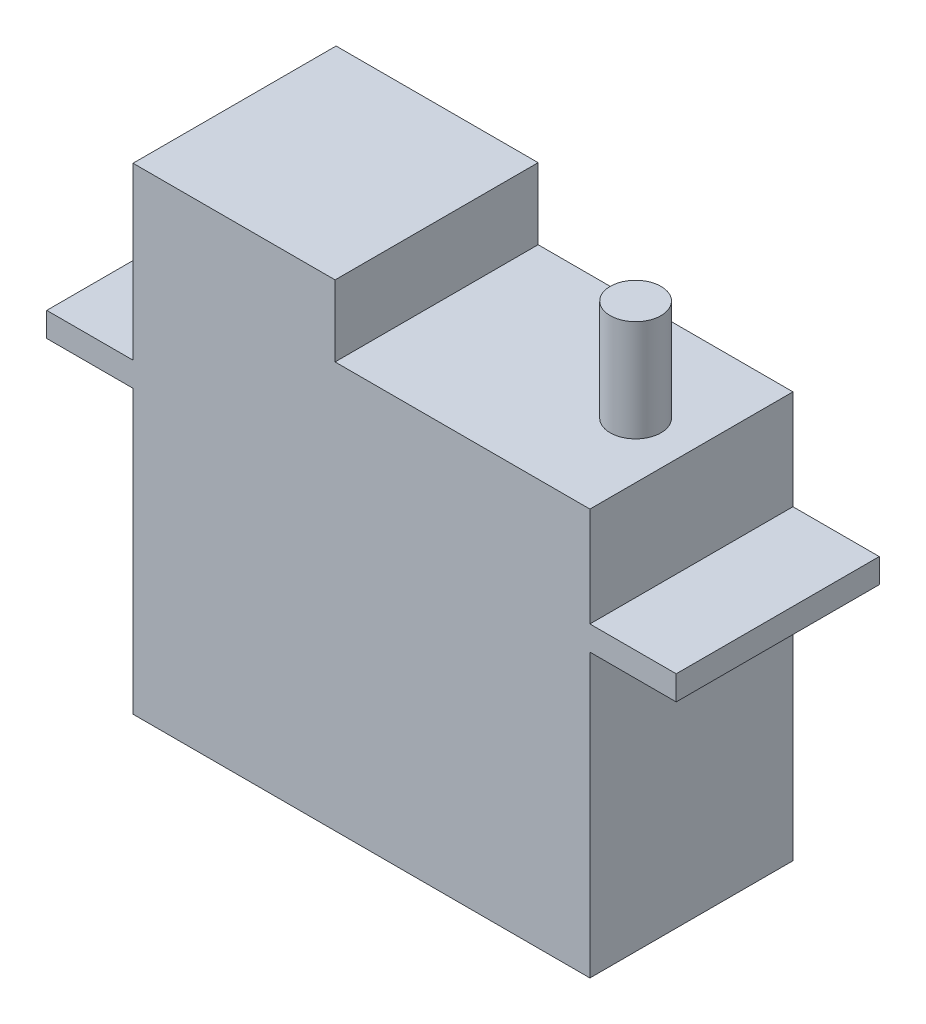
ISO-10303-21;
HEADER;
FILE_DESCRIPTION(('STEP AP214'),'2;1');
FILE_NAME('part.step','',(''),(''),'','','');
FILE_SCHEMA(('AUTOMOTIVE_DESIGN { 1 0 10303 214 1 1 1 1 }'));
ENDSEC;
DATA;
#1=APPLICATION_CONTEXT('core data for automotive mechanical design processes');
#2=APPLICATION_PROTOCOL_DEFINITION('international standard','automotive_design',2000,#1);
#3=PRODUCT_CONTEXT('',#1,'mechanical');
#4=PRODUCT('Part','Part','',(#3));
#5=PRODUCT_RELATED_PRODUCT_CATEGORY('part','',(#4));
#6=PRODUCT_DEFINITION_FORMATION('','',#4);
#7=PRODUCT_DEFINITION_CONTEXT('part definition',#1,'design');
#8=PRODUCT_DEFINITION('design','',#6,#7);
#9=PRODUCT_DEFINITION_SHAPE('','',#8);
#10=(LENGTH_UNIT() NAMED_UNIT(*) SI_UNIT(.MILLI.,.METRE.));
#11=(NAMED_UNIT(*) PLANE_ANGLE_UNIT() SI_UNIT($,.RADIAN.));
#12=(NAMED_UNIT(*) SI_UNIT($,.STERADIAN.) SOLID_ANGLE_UNIT());
#13=UNCERTAINTY_MEASURE_WITH_UNIT(LENGTH_MEASURE(1.E-05),#10,'distance_accuracy_value','');
#14=(GEOMETRIC_REPRESENTATION_CONTEXT(3) GLOBAL_UNCERTAINTY_ASSIGNED_CONTEXT((#13)) GLOBAL_UNIT_ASSIGNED_CONTEXT((#10,
#11,#12)) REPRESENTATION_CONTEXT('',''));
#15=CARTESIAN_POINT('',(0.,0.,0.));
#16=DIRECTION('',(0.,0.,1.));
#17=DIRECTION('',(1.,0.,0.));
#18=AXIS2_PLACEMENT_3D('',#15,#16,#17);
#19=CARTESIAN_POINT('',(22.5,20.,-5.));
#20=DIRECTION('',(-1.,0.,0.));
#21=DIRECTION('',(0.,-1.,0.));
#22=AXIS2_PLACEMENT_3D('',#19,#20,#21);
#23=PLANE('',#22);
#24=DIRECTION('',(0.,0.,1.));
#25=VECTOR('',#24,1.);
#26=CARTESIAN_POINT('',(22.5,20.,-5.));
#27=LINE('',#26,#25);
#28=CARTESIAN_POINT('',(22.5,20.,-5.));
#29=VERTEX_POINT('',#28);
#30=CARTESIAN_POINT('',(22.5,20.,5.));
#31=VERTEX_POINT('',#30);
#32=EDGE_CURVE('E49',#29,#31,#27,.T.);
#33=ORIENTED_EDGE('',*,*,#32,.T.);
#34=DIRECTION('',(0.,-1.,0.));
#35=VECTOR('',#34,1.);
#36=CARTESIAN_POINT('',(22.5,20.,5.));
#37=LINE('',#36,#35);
#38=CARTESIAN_POINT('',(22.5,15.1,5.));
#39=VERTEX_POINT('',#38);
#40=EDGE_CURVE('E149',#31,#39,#37,.T.);
#41=ORIENTED_EDGE('',*,*,#40,.T.);
#42=DIRECTION('',(0.,0.,1.));
#43=VECTOR('',#42,1.);
#44=CARTESIAN_POINT('',(22.5,15.1,-5.));
#45=LINE('',#44,#43);
#46=CARTESIAN_POINT('',(22.5,15.1,-5.));
#47=VERTEX_POINT('',#46);
#48=EDGE_CURVE('E11',#47,#39,#45,.T.);
#49=ORIENTED_EDGE('',*,*,#48,.F.);
#50=DIRECTION('',(0.,-1.,0.));
#51=VECTOR('',#50,1.);
#52=CARTESIAN_POINT('',(22.5,20.,-5.));
#53=LINE('',#52,#51);
#54=EDGE_CURVE('E194',#29,#47,#53,.T.);
#55=ORIENTED_EDGE('',*,*,#54,.F.);
#56=EDGE_LOOP('',(#33,#41,#49,#55));
#57=FACE_BOUND('',#56,.T.);
#58=ADVANCED_FACE('F35',(#57),#23,.F.);
#59=CARTESIAN_POINT('',(22.5,15.1,-5.));
#60=DIRECTION('',(0.,-1.,0.));
#61=DIRECTION('',(0.,0.,-1.));
#62=AXIS2_PLACEMENT_3D('',#59,#60,#61);
#63=PLANE('',#62);
#64=ORIENTED_EDGE('',*,*,#48,.T.);
#65=DIRECTION('',(1.,0.,0.));
#66=VECTOR('',#65,1.);
#67=CARTESIAN_POINT('',(22.5,15.1,5.));
#68=LINE('',#67,#66);
#69=CARTESIAN_POINT('',(26.75,15.1,5.));
#70=VERTEX_POINT('',#69);
#71=EDGE_CURVE('E139',#39,#70,#68,.T.);
#72=ORIENTED_EDGE('',*,*,#71,.T.);
#73=DIRECTION('',(0.,0.,1.));
#74=VECTOR('',#73,1.);
#75=CARTESIAN_POINT('',(26.75,15.1,-5.));
#76=LINE('',#75,#74);
#77=CARTESIAN_POINT('',(26.75,15.1,-5.));
#78=VERTEX_POINT('',#77);
#79=EDGE_CURVE('E42',#78,#70,#76,.T.);
#80=ORIENTED_EDGE('',*,*,#79,.F.);
#81=DIRECTION('',(1.,0.,0.));
#82=VECTOR('',#81,1.);
#83=CARTESIAN_POINT('',(22.5,15.1,-5.));
#84=LINE('',#83,#82);
#85=EDGE_CURVE('E140',#47,#78,#84,.T.);
#86=ORIENTED_EDGE('',*,*,#85,.F.);
#87=EDGE_LOOP('',(#64,#72,#80,#86));
#88=FACE_BOUND('',#87,.T.);
#89=ADVANCED_FACE('F137',(#88),#63,.F.);
#90=CARTESIAN_POINT('',(26.75,15.1,-5.));
#91=DIRECTION('',(-1.,0.,0.));
#92=DIRECTION('',(0.,0.,1.));
#93=AXIS2_PLACEMENT_3D('',#90,#91,#92);
#94=PLANE('',#93);
#95=ORIENTED_EDGE('',*,*,#79,.T.);
#96=DIRECTION('',(0.,-1.,0.));
#97=VECTOR('',#96,1.);
#98=CARTESIAN_POINT('',(26.75,15.1,5.));
#99=LINE('',#98,#97);
#100=CARTESIAN_POINT('',(26.75,13.9,5.));
#101=VERTEX_POINT('',#100);
#102=EDGE_CURVE('E152',#70,#101,#99,.T.);
#103=ORIENTED_EDGE('',*,*,#102,.T.);
#104=DIRECTION('',(0.,0.,1.));
#105=VECTOR('',#104,1.);
#106=CARTESIAN_POINT('',(26.75,13.9,-5.));
#107=LINE('',#106,#105);
#108=CARTESIAN_POINT('',(26.75,13.9,-5.));
#109=VERTEX_POINT('',#108);
#110=EDGE_CURVE('E245',#109,#101,#107,.T.);
#111=ORIENTED_EDGE('',*,*,#110,.F.);
#112=DIRECTION('',(0.,-1.,0.));
#113=VECTOR('',#112,1.);
#114=CARTESIAN_POINT('',(26.75,15.1,-5.));
#115=LINE('',#114,#113);
#116=EDGE_CURVE('E197',#78,#109,#115,.T.);
#117=ORIENTED_EDGE('',*,*,#116,.F.);
#118=EDGE_LOOP('',(#95,#103,#111,#117));
#119=FACE_BOUND('',#118,.T.);
#120=ADVANCED_FACE('F248',(#119),#94,.F.);
#121=CARTESIAN_POINT('',(26.75,13.9,-5.));
#122=DIRECTION('',(0.,1.,0.));
#123=DIRECTION('',(0.,0.,1.));
#124=AXIS2_PLACEMENT_3D('',#121,#122,#123);
#125=PLANE('',#124);
#126=ORIENTED_EDGE('',*,*,#110,.T.);
#127=DIRECTION('',(-1.,0.,0.));
#128=VECTOR('',#127,1.);
#129=CARTESIAN_POINT('',(26.75,13.9,5.));
#130=LINE('',#129,#128);
#131=CARTESIAN_POINT('',(22.5,13.9,5.));
#132=VERTEX_POINT('',#131);
#133=EDGE_CURVE('E162',#101,#132,#130,.T.);
#134=ORIENTED_EDGE('',*,*,#133,.T.);
#135=DIRECTION('',(0.,0.,1.));
#136=VECTOR('',#135,1.);
#137=CARTESIAN_POINT('',(22.5,13.9,-5.));
#138=LINE('',#137,#136);
#139=CARTESIAN_POINT('',(22.5,13.9,-5.));
#140=VERTEX_POINT('',#139);
#141=EDGE_CURVE('E243',#140,#132,#138,.T.);
#142=ORIENTED_EDGE('',*,*,#141,.F.);
#143=DIRECTION('',(-1.,0.,0.));
#144=VECTOR('',#143,1.);
#145=CARTESIAN_POINT('',(26.75,13.9,-5.));
#146=LINE('',#145,#144);
#147=EDGE_CURVE('E199',#109,#140,#146,.T.);
#148=ORIENTED_EDGE('',*,*,#147,.F.);
#149=EDGE_LOOP('',(#126,#134,#142,#148));
#150=FACE_BOUND('',#149,.T.);
#151=ADVANCED_FACE('F294',(#150),#125,.F.);
#152=CARTESIAN_POINT('',(22.5,13.9,-5.));
#153=DIRECTION('',(-1.,0.,0.));
#154=DIRECTION('',(0.,0.,1.));
#155=AXIS2_PLACEMENT_3D('',#152,#153,#154);
#156=PLANE('',#155);
#157=ORIENTED_EDGE('',*,*,#141,.T.);
#158=DIRECTION('',(0.,-1.,0.));
#159=VECTOR('',#158,1.);
#160=CARTESIAN_POINT('',(22.5,13.9,5.));
#161=LINE('',#160,#159);
#162=CARTESIAN_POINT('',(22.5,0.,5.));
#163=VERTEX_POINT('',#162);
#164=EDGE_CURVE('E165',#132,#163,#161,.T.);
#165=ORIENTED_EDGE('',*,*,#164,.T.);
#166=DIRECTION('',(0.,0.,1.));
#167=VECTOR('',#166,1.);
#168=CARTESIAN_POINT('',(22.5,0.,-5.));
#169=LINE('',#168,#167);
#170=CARTESIAN_POINT('',(22.5,0.,-5.));
#171=VERTEX_POINT('',#170);
#172=EDGE_CURVE('E241',#171,#163,#169,.T.);
#173=ORIENTED_EDGE('',*,*,#172,.F.);
#174=DIRECTION('',(0.,-1.,0.));
#175=VECTOR('',#174,1.);
#176=CARTESIAN_POINT('',(22.5,13.9,-5.));
#177=LINE('',#176,#175);
#178=EDGE_CURVE('E201',#140,#171,#177,.T.);
#179=ORIENTED_EDGE('',*,*,#178,.F.);
#180=EDGE_LOOP('',(#157,#165,#173,#179));
#181=FACE_BOUND('',#180,.T.);
#182=ADVANCED_FACE('F292',(#181),#156,.F.);
#183=CARTESIAN_POINT('',(0.,0.,-5.));
#184=DIRECTION('',(0.,-1.,0.));
#185=DIRECTION('',(0.,0.,-1.));
#186=AXIS2_PLACEMENT_3D('',#183,#184,#185);
#187=PLANE('',#186);
#188=ORIENTED_EDGE('',*,*,#172,.T.);
#189=DIRECTION('',(1.,0.,0.));
#190=VECTOR('',#189,1.);
#191=CARTESIAN_POINT('',(0.,0.,5.));
#192=LINE('',#191,#190);
#193=CARTESIAN_POINT('',(0.,0.,5.));
#194=VERTEX_POINT('',#193);
#195=EDGE_CURVE('E168',#194,#163,#192,.T.);
#196=ORIENTED_EDGE('',*,*,#195,.F.);
#197=DIRECTION('',(0.,0.,1.));
#198=VECTOR('',#197,1.);
#199=CARTESIAN_POINT('',(0.,0.,-5.));
#200=LINE('',#199,#198);
#201=CARTESIAN_POINT('',(0.,0.,-5.));
#202=VERTEX_POINT('',#201);
#203=EDGE_CURVE('E239',#202,#194,#200,.T.);
#204=ORIENTED_EDGE('',*,*,#203,.F.);
#205=DIRECTION('',(1.,0.,0.));
#206=VECTOR('',#205,1.);
#207=CARTESIAN_POINT('',(0.,0.,-5.));
#208=LINE('',#207,#206);
#209=EDGE_CURVE('E203',#202,#171,#208,.T.);
#210=ORIENTED_EDGE('',*,*,#209,.T.);
#211=EDGE_LOOP('',(#188,#196,#204,#210));
#212=FACE_BOUND('',#211,.T.);
#213=ADVANCED_FACE('F287',(#212),#187,.T.);
#214=CARTESIAN_POINT('',(0.,13.9,-5.));
#215=DIRECTION('',(-1.,0.,0.));
#216=DIRECTION('',(0.,-1.,0.));
#217=AXIS2_PLACEMENT_3D('',#214,#215,#216);
#218=PLANE('',#217);
#219=ORIENTED_EDGE('',*,*,#203,.T.);
#220=DIRECTION('',(0.,-1.,0.));
#221=VECTOR('',#220,1.);
#222=CARTESIAN_POINT('',(0.,13.9,5.));
#223=LINE('',#222,#221);
#224=CARTESIAN_POINT('',(0.,13.9,5.));
#225=VERTEX_POINT('',#224);
#226=EDGE_CURVE('E171',#225,#194,#223,.T.);
#227=ORIENTED_EDGE('',*,*,#226,.F.);
#228=DIRECTION('',(0.,0.,1.));
#229=VECTOR('',#228,1.);
#230=CARTESIAN_POINT('',(0.,13.9,-5.));
#231=LINE('',#230,#229);
#232=CARTESIAN_POINT('',(0.,13.9,-5.));
#233=VERTEX_POINT('',#232);
#234=EDGE_CURVE('E237',#233,#225,#231,.T.);
#235=ORIENTED_EDGE('',*,*,#234,.F.);
#236=DIRECTION('',(0.,-1.,0.));
#237=VECTOR('',#236,1.);
#238=CARTESIAN_POINT('',(0.,13.9,-5.));
#239=LINE('',#238,#237);
#240=EDGE_CURVE('E206',#233,#202,#239,.T.);
#241=ORIENTED_EDGE('',*,*,#240,.T.);
#242=EDGE_LOOP('',(#219,#227,#235,#241));
#243=FACE_BOUND('',#242,.T.);
#244=ADVANCED_FACE('F283',(#243),#218,.T.);
#245=CARTESIAN_POINT('',(0.,13.9,-5.));
#246=DIRECTION('',(0.,1.,0.));
#247=DIRECTION('',(-1.,0.,0.));
#248=AXIS2_PLACEMENT_3D('',#245,#246,#247);
#249=PLANE('',#248);
#250=ORIENTED_EDGE('',*,*,#234,.T.);
#251=DIRECTION('',(-1.,0.,0.));
#252=VECTOR('',#251,1.);
#253=CARTESIAN_POINT('',(0.,13.9,5.));
#254=LINE('',#253,#252);
#255=CARTESIAN_POINT('',(-4.25,13.9,5.));
#256=VERTEX_POINT('',#255);
#257=EDGE_CURVE('E174',#225,#256,#254,.T.);
#258=ORIENTED_EDGE('',*,*,#257,.T.);
#259=DIRECTION('',(0.,0.,1.));
#260=VECTOR('',#259,1.);
#261=CARTESIAN_POINT('',(-4.25,13.9,-5.));
#262=LINE('',#261,#260);
#263=CARTESIAN_POINT('',(-4.25,13.9,-5.));
#264=VERTEX_POINT('',#263);
#265=EDGE_CURVE('E235',#264,#256,#262,.T.);
#266=ORIENTED_EDGE('',*,*,#265,.F.);
#267=DIRECTION('',(-1.,0.,0.));
#268=VECTOR('',#267,1.);
#269=CARTESIAN_POINT('',(0.,13.9,-5.));
#270=LINE('',#269,#268);
#271=EDGE_CURVE('E209',#233,#264,#270,.T.);
#272=ORIENTED_EDGE('',*,*,#271,.F.);
#273=EDGE_LOOP('',(#250,#258,#266,#272));
#274=FACE_BOUND('',#273,.T.);
#275=ADVANCED_FACE('F278',(#274),#249,.F.);
#276=CARTESIAN_POINT('',(-4.25,13.9,-5.));
#277=DIRECTION('',(1.,0.,0.));
#278=DIRECTION('',(0.,0.,-1.));
#279=AXIS2_PLACEMENT_3D('',#276,#277,#278);
#280=PLANE('',#279);
#281=ORIENTED_EDGE('',*,*,#265,.T.);
#282=DIRECTION('',(0.,1.,0.));
#283=VECTOR('',#282,1.);
#284=CARTESIAN_POINT('',(-4.25,13.9,5.));
#285=LINE('',#284,#283);
#286=CARTESIAN_POINT('',(-4.25,15.1,5.));
#287=VERTEX_POINT('',#286);
#288=EDGE_CURVE('E177',#256,#287,#285,.T.);
#289=ORIENTED_EDGE('',*,*,#288,.T.);
#290=DIRECTION('',(0.,0.,1.));
#291=VECTOR('',#290,1.);
#292=CARTESIAN_POINT('',(-4.25,15.1,-5.));
#293=LINE('',#292,#291);
#294=CARTESIAN_POINT('',(-4.25,15.1,-5.));
#295=VERTEX_POINT('',#294);
#296=EDGE_CURVE('E233',#295,#287,#293,.T.);
#297=ORIENTED_EDGE('',*,*,#296,.F.);
#298=DIRECTION('',(0.,1.,0.));
#299=VECTOR('',#298,1.);
#300=CARTESIAN_POINT('',(-4.25,13.9,-5.));
#301=LINE('',#300,#299);
#302=EDGE_CURVE('E211',#264,#295,#301,.T.);
#303=ORIENTED_EDGE('',*,*,#302,.F.);
#304=EDGE_LOOP('',(#281,#289,#297,#303));
#305=FACE_BOUND('',#304,.T.);
#306=ADVANCED_FACE('F274',(#305),#280,.F.);
#307=CARTESIAN_POINT('',(-4.25,15.1,-5.));
#308=DIRECTION('',(0.,-1.,0.));
#309=DIRECTION('',(0.,0.,-1.));
#310=AXIS2_PLACEMENT_3D('',#307,#308,#309);
#311=PLANE('',#310);
#312=ORIENTED_EDGE('',*,*,#296,.T.);
#313=DIRECTION('',(1.,0.,0.));
#314=VECTOR('',#313,1.);
#315=CARTESIAN_POINT('',(-4.25,15.1,5.));
#316=LINE('',#315,#314);
#317=CARTESIAN_POINT('',(0.,15.1,5.));
#318=VERTEX_POINT('',#317);
#319=EDGE_CURVE('E180',#287,#318,#316,.T.);
#320=ORIENTED_EDGE('',*,*,#319,.T.);
#321=DIRECTION('',(0.,0.,1.));
#322=VECTOR('',#321,1.);
#323=CARTESIAN_POINT('',(0.,15.1,-5.));
#324=LINE('',#323,#322);
#325=CARTESIAN_POINT('',(0.,15.1,-5.));
#326=VERTEX_POINT('',#325);
#327=EDGE_CURVE('E231',#326,#318,#324,.T.);
#328=ORIENTED_EDGE('',*,*,#327,.F.);
#329=DIRECTION('',(1.,0.,0.));
#330=VECTOR('',#329,1.);
#331=CARTESIAN_POINT('',(-4.25,15.1,-5.));
#332=LINE('',#331,#330);
#333=EDGE_CURVE('E213',#295,#326,#332,.T.);
#334=ORIENTED_EDGE('',*,*,#333,.F.);
#335=EDGE_LOOP('',(#312,#320,#328,#334));
#336=FACE_BOUND('',#335,.T.);
#337=ADVANCED_FACE('F270',(#336),#311,.F.);
#338=CARTESIAN_POINT('',(0.,23.5,-5.));
#339=DIRECTION('',(-1.,0.,0.));
#340=DIRECTION('',(0.,-1.,0.));
#341=AXIS2_PLACEMENT_3D('',#338,#339,#340);
#342=PLANE('',#341);
#343=ORIENTED_EDGE('',*,*,#327,.T.);
#344=DIRECTION('',(0.,-1.,0.));
#345=VECTOR('',#344,1.);
#346=CARTESIAN_POINT('',(0.,23.5,5.));
#347=LINE('',#346,#345);
#348=CARTESIAN_POINT('',(0.,23.5,5.));
#349=VERTEX_POINT('',#348);
#350=EDGE_CURVE('E183',#349,#318,#347,.T.);
#351=ORIENTED_EDGE('',*,*,#350,.F.);
#352=DIRECTION('',(0.,0.,1.));
#353=VECTOR('',#352,1.);
#354=CARTESIAN_POINT('',(0.,23.5,-5.));
#355=LINE('',#354,#353);
#356=CARTESIAN_POINT('',(0.,23.5,-5.));
#357=VERTEX_POINT('',#356);
#358=EDGE_CURVE('E229',#357,#349,#355,.T.);
#359=ORIENTED_EDGE('',*,*,#358,.F.);
#360=DIRECTION('',(0.,-1.,0.));
#361=VECTOR('',#360,1.);
#362=CARTESIAN_POINT('',(0.,23.5,-5.));
#363=LINE('',#362,#361);
#364=EDGE_CURVE('E215',#357,#326,#363,.T.);
#365=ORIENTED_EDGE('',*,*,#364,.T.);
#366=EDGE_LOOP('',(#343,#351,#359,#365));
#367=FACE_BOUND('',#366,.T.);
#368=ADVANCED_FACE('F265',(#367),#342,.T.);
#369=CARTESIAN_POINT('',(9.94999999999999,23.5,-5.));
#370=DIRECTION('',(0.,1.,0.));
#371=DIRECTION('',(-1.,0.,0.));
#372=AXIS2_PLACEMENT_3D('',#369,#370,#371);
#373=PLANE('',#372);
#374=ORIENTED_EDGE('',*,*,#358,.T.);
#375=DIRECTION('',(-1.,0.,0.));
#376=VECTOR('',#375,1.);
#377=CARTESIAN_POINT('',(9.94999999999999,23.5,5.));
#378=LINE('',#377,#376);
#379=CARTESIAN_POINT('',(9.94999999999999,23.5,5.));
#380=VERTEX_POINT('',#379);
#381=EDGE_CURVE('E186',#380,#349,#378,.T.);
#382=ORIENTED_EDGE('',*,*,#381,.F.);
#383=DIRECTION('',(0.,0.,1.));
#384=VECTOR('',#383,1.);
#385=CARTESIAN_POINT('',(9.94999999999999,23.5,-5.));
#386=LINE('',#385,#384);
#387=CARTESIAN_POINT('',(9.94999999999999,23.5,-5.));
#388=VERTEX_POINT('',#387);
#389=EDGE_CURVE('E227',#388,#380,#386,.T.);
#390=ORIENTED_EDGE('',*,*,#389,.F.);
#391=DIRECTION('',(-1.,0.,0.));
#392=VECTOR('',#391,1.);
#393=CARTESIAN_POINT('',(9.94999999999999,23.5,-5.));
#394=LINE('',#393,#392);
#395=EDGE_CURVE('E218',#388,#357,#394,.T.);
#396=ORIENTED_EDGE('',*,*,#395,.T.);
#397=EDGE_LOOP('',(#374,#382,#390,#396));
#398=FACE_BOUND('',#397,.T.);
#399=ADVANCED_FACE('F260',(#398),#373,.T.);
#400=CARTESIAN_POINT('',(9.94999999999999,20.,-5.));
#401=DIRECTION('',(1.,0.,0.));
#402=DIRECTION('',(0.,0.,-1.));
#403=AXIS2_PLACEMENT_3D('',#400,#401,#402);
#404=PLANE('',#403);
#405=ORIENTED_EDGE('',*,*,#389,.T.);
#406=DIRECTION('',(0.,1.,0.));
#407=VECTOR('',#406,1.);
#408=CARTESIAN_POINT('',(9.94999999999999,20.,5.));
#409=LINE('',#408,#407);
#410=CARTESIAN_POINT('',(9.94999999999999,20.,5.));
#411=VERTEX_POINT('',#410);
#412=EDGE_CURVE('E189',#411,#380,#409,.T.);
#413=ORIENTED_EDGE('',*,*,#412,.F.);
#414=DIRECTION('',(0.,0.,1.));
#415=VECTOR('',#414,1.);
#416=CARTESIAN_POINT('',(9.94999999999999,20.,-5.));
#417=LINE('',#416,#415);
#418=CARTESIAN_POINT('',(9.94999999999999,20.,-5.));
#419=VERTEX_POINT('',#418);
#420=EDGE_CURVE('E57',#419,#411,#417,.T.);
#421=ORIENTED_EDGE('',*,*,#420,.F.);
#422=DIRECTION('',(0.,1.,0.));
#423=VECTOR('',#422,1.);
#424=CARTESIAN_POINT('',(9.94999999999999,20.,-5.));
#425=LINE('',#424,#423);
#426=EDGE_CURVE('E221',#419,#388,#425,.T.);
#427=ORIENTED_EDGE('',*,*,#426,.T.);
#428=EDGE_LOOP('',(#405,#413,#421,#427));
#429=FACE_BOUND('',#428,.T.);
#430=ADVANCED_FACE('F258',(#429),#404,.T.);
#431=CARTESIAN_POINT('',(22.5,20.,-5.));
#432=DIRECTION('',(0.,1.,0.));
#433=DIRECTION('',(0.,0.,1.));
#434=AXIS2_PLACEMENT_3D('',#431,#432,#433);
#435=PLANE('',#434);
#436=CARTESIAN_POINT('',(19.75,20.,0.));
#437=DIRECTION('',(0.,1.,0.));
#438=DIRECTION('',(0.,0.,1.));
#439=AXIS2_PLACEMENT_3D('',#436,#437,#438);
#440=CIRCLE('',#439,1.25);
#441=CARTESIAN_POINT('',(19.75,20.,1.25));
#442=VERTEX_POINT('',#441);
#443=EDGE_CURVE('E157',#442,#442,#440,.T.);
#444=ORIENTED_EDGE('',*,*,#443,.F.);
#445=EDGE_LOOP('',(#444));
#446=FACE_BOUND('',#445,.T.);
#447=ORIENTED_EDGE('',*,*,#420,.T.);
#448=DIRECTION('',(-1.,0.,0.));
#449=VECTOR('',#448,1.);
#450=CARTESIAN_POINT('',(22.5,20.,5.));
#451=LINE('',#450,#449);
#452=EDGE_CURVE('E192',#31,#411,#451,.T.);
#453=ORIENTED_EDGE('',*,*,#452,.F.);
#454=ORIENTED_EDGE('',*,*,#32,.F.);
#455=DIRECTION('',(-1.,0.,0.));
#456=VECTOR('',#455,1.);
#457=CARTESIAN_POINT('',(22.5,20.,-5.));
#458=LINE('',#457,#456);
#459=EDGE_CURVE('E223',#29,#419,#458,.T.);
#460=ORIENTED_EDGE('',*,*,#459,.T.);
#461=EDGE_LOOP('',(#447,#453,#454,#460));
#462=FACE_BOUND('',#461,.T.);
#463=ADVANCED_FACE('F256',(#446,#462),#435,.T.);
#464=CARTESIAN_POINT('',(0.,0.,-5.));
#465=DIRECTION('',(0.,0.,1.));
#466=DIRECTION('',(1.,0.,0.));
#467=AXIS2_PLACEMENT_3D('',#464,#465,#466);
#468=PLANE('',#467);
#469=ORIENTED_EDGE('',*,*,#54,.T.);
#470=ORIENTED_EDGE('',*,*,#85,.T.);
#471=ORIENTED_EDGE('',*,*,#116,.T.);
#472=ORIENTED_EDGE('',*,*,#147,.T.);
#473=ORIENTED_EDGE('',*,*,#178,.T.);
#474=ORIENTED_EDGE('',*,*,#209,.F.);
#475=ORIENTED_EDGE('',*,*,#240,.F.);
#476=ORIENTED_EDGE('',*,*,#271,.T.);
#477=ORIENTED_EDGE('',*,*,#302,.T.);
#478=ORIENTED_EDGE('',*,*,#333,.T.);
#479=ORIENTED_EDGE('',*,*,#364,.F.);
#480=ORIENTED_EDGE('',*,*,#395,.F.);
#481=ORIENTED_EDGE('',*,*,#426,.F.);
#482=ORIENTED_EDGE('',*,*,#459,.F.);
#483=EDGE_LOOP('',(#469,#470,#471,#472,#473,#474,#475,#476,#477,#478,#479,#480,#481,#482));
#484=FACE_BOUND('',#483,.T.);
#485=ADVANCED_FACE('F252',(#484),#468,.F.);
#486=CARTESIAN_POINT('',(0.,0.,5.));
#487=DIRECTION('',(0.,0.,1.));
#488=DIRECTION('',(1.,0.,0.));
#489=AXIS2_PLACEMENT_3D('',#486,#487,#488);
#490=PLANE('',#489);
#491=ORIENTED_EDGE('',*,*,#40,.F.);
#492=ORIENTED_EDGE('',*,*,#452,.T.);
#493=ORIENTED_EDGE('',*,*,#412,.T.);
#494=ORIENTED_EDGE('',*,*,#381,.T.);
#495=ORIENTED_EDGE('',*,*,#350,.T.);
#496=ORIENTED_EDGE('',*,*,#319,.F.);
#497=ORIENTED_EDGE('',*,*,#288,.F.);
#498=ORIENTED_EDGE('',*,*,#257,.F.);
#499=ORIENTED_EDGE('',*,*,#226,.T.);
#500=ORIENTED_EDGE('',*,*,#195,.T.);
#501=ORIENTED_EDGE('',*,*,#164,.F.);
#502=ORIENTED_EDGE('',*,*,#133,.F.);
#503=ORIENTED_EDGE('',*,*,#102,.F.);
#504=ORIENTED_EDGE('',*,*,#71,.F.);
#505=EDGE_LOOP('',(#491,#492,#493,#494,#495,#496,#497,#498,#499,#500,#501,#502,#503,#504));
#506=FACE_BOUND('',#505,.T.);
#507=ADVANCED_FACE('F147',(#506),#490,.T.);
#508=CARTESIAN_POINT('',(19.75,25.,0.));
#509=DIRECTION('',(0.,-1.,0.));
#510=DIRECTION('',(0.,0.,-1.));
#511=AXIS2_PLACEMENT_3D('',#508,#509,#510);
#512=CYLINDRICAL_SURFACE('',#511,1.25);
#513=CARTESIAN_POINT('',(19.75,25.,0.));
#514=DIRECTION('',(0.,1.,0.));
#515=DIRECTION('',(0.,0.,1.));
#516=AXIS2_PLACEMENT_3D('',#513,#514,#515);
#517=CIRCLE('',#516,1.25);
#518=CARTESIAN_POINT('',(19.75,25.,1.25));
#519=VERTEX_POINT('',#518);
#520=EDGE_CURVE('E154',#519,#519,#517,.T.);
#521=ORIENTED_EDGE('',*,*,#520,.F.);
#522=EDGE_LOOP('',(#521));
#523=FACE_BOUND('',#522,.T.);
#524=ORIENTED_EDGE('',*,*,#443,.T.);
#525=EDGE_LOOP('',(#524));
#526=FACE_BOUND('',#525,.T.);
#527=ADVANCED_FACE('F406',(#523,#526),#512,.T.);
#528=CARTESIAN_POINT('',(19.75,25.,0.));
#529=DIRECTION('',(0.,1.,0.));
#530=DIRECTION('',(0.,0.,1.));
#531=AXIS2_PLACEMENT_3D('',#528,#529,#530);
#532=PLANE('',#531);
#533=ORIENTED_EDGE('',*,*,#520,.T.);
#534=EDGE_LOOP('',(#533));
#535=FACE_BOUND('',#534,.T.);
#536=ADVANCED_FACE('F422',(#535),#532,.T.);
#537=CLOSED_SHELL('',(#58,#89,#120,#151,#182,#213,#244,#275,#306,#337,#368,#399,#430,#463,#485,
#507,#527,#536));
#538=MANIFOLD_SOLID_BREP('B2',#537);
#539=ADVANCED_BREP_SHAPE_REPRESENTATION('',(#18,#538),#14);
#540=SHAPE_DEFINITION_REPRESENTATION(#9,#539);
ENDSEC;
END-ISO-10303-21;
